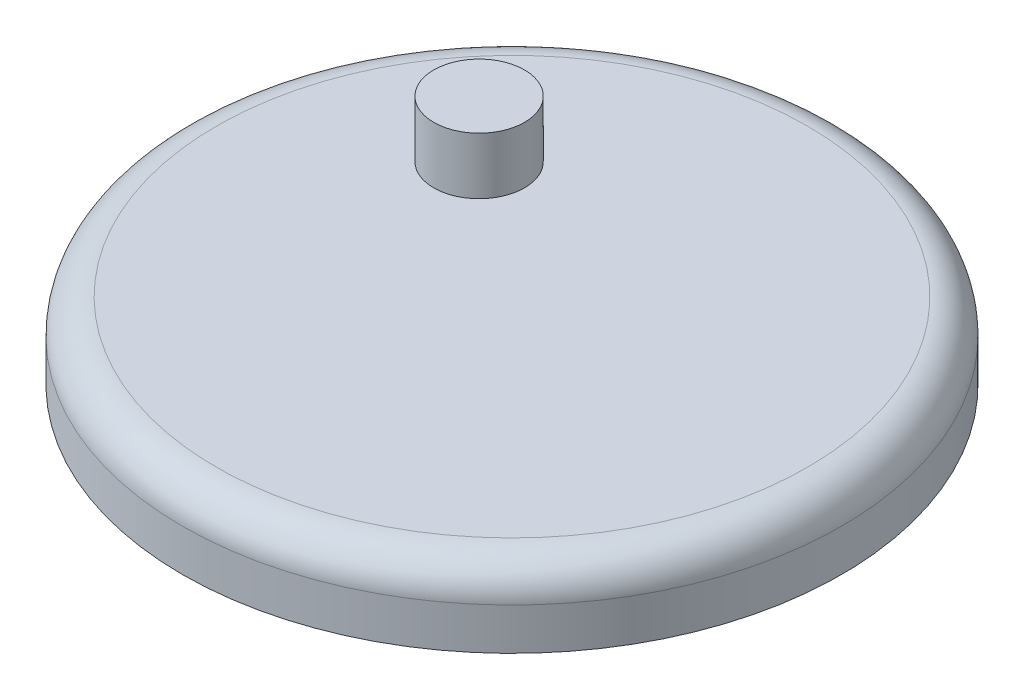
ISO-10303-21;
HEADER;
FILE_DESCRIPTION(('STEP AP214'),'2;1');
FILE_NAME('part.step','',(''),(''),'','','');
FILE_SCHEMA(('AUTOMOTIVE_DESIGN { 1 0 10303 214 1 1 1 1 }'));
ENDSEC;
DATA;
#1=APPLICATION_CONTEXT('core data for automotive mechanical design processes');
#2=APPLICATION_PROTOCOL_DEFINITION('international standard','automotive_design',2000,#1);
#3=PRODUCT_CONTEXT('',#1,'mechanical');
#4=PRODUCT('Part','Part','',(#3));
#5=PRODUCT_RELATED_PRODUCT_CATEGORY('part','',(#4));
#6=PRODUCT_DEFINITION_FORMATION('','',#4);
#7=PRODUCT_DEFINITION_CONTEXT('part definition',#1,'design');
#8=PRODUCT_DEFINITION('design','',#6,#7);
#9=PRODUCT_DEFINITION_SHAPE('','',#8);
#10=(LENGTH_UNIT() NAMED_UNIT(*) SI_UNIT(.MILLI.,.METRE.));
#11=(NAMED_UNIT(*) PLANE_ANGLE_UNIT() SI_UNIT($,.RADIAN.));
#12=(NAMED_UNIT(*) SI_UNIT($,.STERADIAN.) SOLID_ANGLE_UNIT());
#13=UNCERTAINTY_MEASURE_WITH_UNIT(LENGTH_MEASURE(1.E-05),#10,'distance_accuracy_value','');
#14=(GEOMETRIC_REPRESENTATION_CONTEXT(3) GLOBAL_UNCERTAINTY_ASSIGNED_CONTEXT((#13)) GLOBAL_UNIT_ASSIGNED_CONTEXT((#10,
#11,#12)) REPRESENTATION_CONTEXT('',''));
#15=CARTESIAN_POINT('',(0.,0.,0.));
#16=DIRECTION('',(0.,0.,1.));
#17=DIRECTION('',(1.,0.,0.));
#18=AXIS2_PLACEMENT_3D('',#15,#16,#17);
#19=CARTESIAN_POINT('',(0.,0.,0.));
#20=DIRECTION('',(0.,1.,0.));
#21=DIRECTION('',(0.,0.,1.));
#22=AXIS2_PLACEMENT_3D('',#19,#20,#21);
#23=PLANE('',#22);
#24=CARTESIAN_POINT('',(0.,0.,0.));
#25=DIRECTION('',(0.,1.,0.));
#26=DIRECTION('',(0.,0.,1.));
#27=AXIS2_PLACEMENT_3D('',#24,#25,#26);
#28=CIRCLE('',#27,27.0331609895949);
#29=CARTESIAN_POINT('',(0.,0.,27.0331609895949));
#30=VERTEX_POINT('',#29);
#31=EDGE_CURVE('E66',#30,#30,#28,.T.);
#32=ORIENTED_EDGE('',*,*,#31,.T.);
#33=EDGE_LOOP('',(#32));
#34=FACE_BOUND('',#33,.T.);
#35=CARTESIAN_POINT('',(0.,0.,0.));
#36=DIRECTION('',(0.,1.,0.));
#37=DIRECTION('',(0.,0.,1.));
#38=AXIS2_PLACEMENT_3D('',#35,#36,#37);
#39=CIRCLE('',#38,29.0331609895949);
#40=CARTESIAN_POINT('',(0.,0.,29.0331609895949));
#41=VERTEX_POINT('',#40);
#42=EDGE_CURVE('E55',#41,#41,#39,.T.);
#43=ORIENTED_EDGE('',*,*,#42,.F.);
#44=EDGE_LOOP('',(#43));
#45=FACE_BOUND('',#44,.T.);
#46=ADVANCED_FACE('F37',(#34,#45),#23,.F.);
#47=CARTESIAN_POINT('',(0.,6.6883173849651,0.));
#48=DIRECTION('',(0.,1.,0.));
#49=DIRECTION('',(0.,0.,1.));
#50=AXIS2_PLACEMENT_3D('',#47,#48,#49);
#51=CYLINDRICAL_SURFACE('',#50,29.0331609895949);
#52=CARTESIAN_POINT('',(0.,3.6883173849651,0.));
#53=DIRECTION('',(0.,-1.,0.));
#54=DIRECTION('',(0.,0.,-1.));
#55=AXIS2_PLACEMENT_3D('',#52,#53,#54);
#56=CIRCLE('',#55,29.0331609895949);
#57=CARTESIAN_POINT('',(0.,3.6883173849651,-29.0331609895949));
#58=VERTEX_POINT('',#57);
#59=EDGE_CURVE('E45',#58,#58,#56,.T.);
#60=ORIENTED_EDGE('',*,*,#59,.T.);
#61=EDGE_LOOP('',(#60));
#62=FACE_BOUND('',#61,.T.);
#63=ORIENTED_EDGE('',*,*,#42,.T.);
#64=EDGE_LOOP('',(#63));
#65=FACE_BOUND('',#64,.T.);
#66=ADVANCED_FACE('F99',(#62,#65),#51,.T.);
#67=CARTESIAN_POINT('',(29.0331609895949,6.6883173849651,0.));
#68=DIRECTION('',(0.,-1.,0.));
#69=DIRECTION('',(0.,0.,-1.));
#70=AXIS2_PLACEMENT_3D('',#67,#68,#69);
#71=PLANE('',#70);
#72=CARTESIAN_POINT('',(-11.7472391516628,6.6883173849651,-8.85167214226006));
#73=DIRECTION('',(0.,-1.,0.));
#74=DIRECTION('',(0.,0.,-1.));
#75=AXIS2_PLACEMENT_3D('',#72,#73,#74);
#76=CIRCLE('',#75,4.);
#77=CARTESIAN_POINT('',(-11.7472391516628,6.6883173849651,-12.8516721422601));
#78=VERTEX_POINT('',#77);
#79=EDGE_CURVE('E10',#78,#78,#76,.F.);
#80=ORIENTED_EDGE('',*,*,#79,.F.);
#81=EDGE_LOOP('',(#80));
#82=FACE_BOUND('',#81,.T.);
#83=CARTESIAN_POINT('',(0.,6.6883173849651,0.));
#84=DIRECTION('',(0.,-1.,0.));
#85=DIRECTION('',(0.,0.,-1.));
#86=AXIS2_PLACEMENT_3D('',#83,#84,#85);
#87=CIRCLE('',#86,26.0331609895949);
#88=CARTESIAN_POINT('',(0.,6.6883173849651,-26.0331609895949));
#89=VERTEX_POINT('',#88);
#90=EDGE_CURVE('E50',#89,#89,#87,.F.);
#91=ORIENTED_EDGE('',*,*,#90,.T.);
#92=EDGE_LOOP('',(#91));
#93=FACE_BOUND('',#92,.T.);
#94=ADVANCED_FACE('F103',(#82,#93),#71,.F.);
#95=CARTESIAN_POINT('',(0.,3.6883173849651,0.));
#96=DIRECTION('',(0.,-1.,0.));
#97=DIRECTION('',(0.,0.,-1.));
#98=AXIS2_PLACEMENT_3D('',#95,#96,#97);
#99=TOROIDAL_SURFACE('',#98,26.0331609895949,3.);
#100=ORIENTED_EDGE('',*,*,#59,.F.);
#101=EDGE_LOOP('',(#100));
#102=FACE_BOUND('',#101,.T.);
#103=ORIENTED_EDGE('',*,*,#90,.F.);
#104=EDGE_LOOP('',(#103));
#105=FACE_BOUND('',#104,.T.);
#106=ADVANCED_FACE('F39',(#102,#105),#99,.T.);
#107=CARTESIAN_POINT('',(-11.7472391516628,11.6883173849651,-8.85167214226006));
#108=DIRECTION('',(0.,-1.,0.));
#109=DIRECTION('',(0.,0.,-1.));
#110=AXIS2_PLACEMENT_3D('',#107,#108,#109);
#111=CYLINDRICAL_SURFACE('',#110,4.);
#112=CARTESIAN_POINT('',(-11.7472391516628,11.6883173849651,-8.85167214226006));
#113=DIRECTION('',(0.,1.,0.));
#114=DIRECTION('',(0.,0.,1.));
#115=AXIS2_PLACEMENT_3D('',#112,#113,#114);
#116=CIRCLE('',#115,4.);
#117=CARTESIAN_POINT('',(-11.7472391516628,11.6883173849651,-4.85167214226006));
#118=VERTEX_POINT('',#117);
#119=EDGE_CURVE('E61',#118,#118,#116,.T.);
#120=ORIENTED_EDGE('',*,*,#119,.F.);
#121=EDGE_LOOP('',(#120));
#122=FACE_BOUND('',#121,.T.);
#123=ORIENTED_EDGE('',*,*,#79,.T.);
#124=EDGE_LOOP('',(#123));
#125=FACE_BOUND('',#124,.T.);
#126=ADVANCED_FACE('F111',(#122,#125),#111,.T.);
#127=CARTESIAN_POINT('',(-11.7472391516628,11.6883173849651,-8.85167214226006));
#128=DIRECTION('',(0.,1.,0.));
#129=DIRECTION('',(0.,0.,1.));
#130=AXIS2_PLACEMENT_3D('',#127,#128,#129);
#131=PLANE('',#130);
#132=ORIENTED_EDGE('',*,*,#119,.T.);
#133=EDGE_LOOP('',(#132));
#134=FACE_BOUND('',#133,.T.);
#135=ADVANCED_FACE('F93',(#134),#131,.T.);
#136=CARTESIAN_POINT('',(0.,6.6883173849651,0.));
#137=DIRECTION('',(0.,1.,0.));
#138=DIRECTION('',(0.,0.,1.));
#139=AXIS2_PLACEMENT_3D('',#136,#137,#138);
#140=CYLINDRICAL_SURFACE('',#139,27.0331609895949);
#141=CARTESIAN_POINT('',(0.,3.6883173849651,0.));
#142=DIRECTION('',(0.,1.,0.));
#143=DIRECTION('',(0.,0.,1.));
#144=AXIS2_PLACEMENT_3D('',#141,#142,#143);
#145=CIRCLE('',#144,27.0331609895949);
#146=CARTESIAN_POINT('',(0.,3.6883173849651,27.0331609895949));
#147=VERTEX_POINT('',#146);
#148=EDGE_CURVE('E78',#147,#147,#145,.F.);
#149=ORIENTED_EDGE('',*,*,#148,.F.);
#150=EDGE_LOOP('',(#149));
#151=FACE_BOUND('',#150,.T.);
#152=ORIENTED_EDGE('',*,*,#31,.F.);
#153=EDGE_LOOP('',(#152));
#154=FACE_BOUND('',#153,.T.);
#155=ADVANCED_FACE('F89',(#151,#154),#140,.F.);
#156=CARTESIAN_POINT('',(29.0331609895949,4.6883173849651,0.));
#157=DIRECTION('',(0.,-1.,0.));
#158=DIRECTION('',(0.,0.,-1.));
#159=AXIS2_PLACEMENT_3D('',#156,#157,#158);
#160=PLANE('',#159);
#161=CARTESIAN_POINT('',(-11.7472391516628,4.6883173849651,-8.85167214226006));
#162=DIRECTION('',(0.,-1.,0.));
#163=DIRECTION('',(0.,0.,-1.));
#164=AXIS2_PLACEMENT_3D('',#161,#162,#163);
#165=CIRCLE('',#164,2.);
#166=CARTESIAN_POINT('',(-11.7472391516628,4.6883173849651,-10.8516721422601));
#167=VERTEX_POINT('',#166);
#168=EDGE_CURVE('E65',#167,#167,#165,.F.);
#169=ORIENTED_EDGE('',*,*,#168,.T.);
#170=EDGE_LOOP('',(#169));
#171=FACE_BOUND('',#170,.T.);
#172=CARTESIAN_POINT('',(0.,4.6883173849651,0.));
#173=DIRECTION('',(0.,-1.,0.));
#174=DIRECTION('',(0.,0.,-1.));
#175=AXIS2_PLACEMENT_3D('',#172,#173,#174);
#176=CIRCLE('',#175,26.0331609895949);
#177=CARTESIAN_POINT('',(0.,4.6883173849651,-26.0331609895949));
#178=VERTEX_POINT('',#177);
#179=EDGE_CURVE('E70',#178,#178,#176,.F.);
#180=ORIENTED_EDGE('',*,*,#179,.F.);
#181=EDGE_LOOP('',(#180));
#182=FACE_BOUND('',#181,.T.);
#183=ADVANCED_FACE('F92',(#171,#182),#160,.T.);
#184=CARTESIAN_POINT('',(0.,3.6883173849651,0.));
#185=DIRECTION('',(0.,-1.,0.));
#186=DIRECTION('',(0.,0.,-1.));
#187=AXIS2_PLACEMENT_3D('',#184,#185,#186);
#188=TOROIDAL_SURFACE('',#187,26.0331609895949,1.);
#189=ORIENTED_EDGE('',*,*,#148,.T.);
#190=EDGE_LOOP('',(#189));
#191=FACE_BOUND('',#190,.T.);
#192=ORIENTED_EDGE('',*,*,#179,.T.);
#193=EDGE_LOOP('',(#192));
#194=FACE_BOUND('',#193,.T.);
#195=ADVANCED_FACE('F86',(#191,#194),#188,.F.);
#196=CARTESIAN_POINT('',(-11.7472391516628,11.6883173849651,-8.85167214226006));
#197=DIRECTION('',(0.,-1.,0.));
#198=DIRECTION('',(0.,0.,-1.));
#199=AXIS2_PLACEMENT_3D('',#196,#197,#198);
#200=CYLINDRICAL_SURFACE('',#199,2.);
#201=CARTESIAN_POINT('',(-11.7472391516628,9.6883173849651,-8.85167214226006));
#202=DIRECTION('',(0.,1.,0.));
#203=DIRECTION('',(0.,0.,1.));
#204=AXIS2_PLACEMENT_3D('',#201,#202,#203);
#205=CIRCLE('',#204,2.);
#206=CARTESIAN_POINT('',(-11.7472391516628,9.6883173849651,-6.85167214226006));
#207=VERTEX_POINT('',#206);
#208=EDGE_CURVE('E71',#207,#207,#205,.T.);
#209=ORIENTED_EDGE('',*,*,#208,.T.);
#210=EDGE_LOOP('',(#209));
#211=FACE_BOUND('',#210,.T.);
#212=ORIENTED_EDGE('',*,*,#168,.F.);
#213=EDGE_LOOP('',(#212));
#214=FACE_BOUND('',#213,.T.);
#215=ADVANCED_FACE('F121',(#211,#214),#200,.F.);
#216=CARTESIAN_POINT('',(-11.7472391516628,9.6883173849651,-8.85167214226006));
#217=DIRECTION('',(0.,1.,0.));
#218=DIRECTION('',(0.,0.,1.));
#219=AXIS2_PLACEMENT_3D('',#216,#217,#218);
#220=PLANE('',#219);
#221=ORIENTED_EDGE('',*,*,#208,.F.);
#222=EDGE_LOOP('',(#221));
#223=FACE_BOUND('',#222,.T.);
#224=ADVANCED_FACE('F118',(#223),#220,.F.);
#225=CLOSED_SHELL('',(#46,#66,#94,#106,#126,#135,#155,#183,#195,#215,#224));
#226=MANIFOLD_SOLID_BREP('B2',#225);
#227=ADVANCED_BREP_SHAPE_REPRESENTATION('',(#18,#226),#14);
#228=SHAPE_DEFINITION_REPRESENTATION(#9,#227);
ENDSEC;
END-ISO-10303-21;
